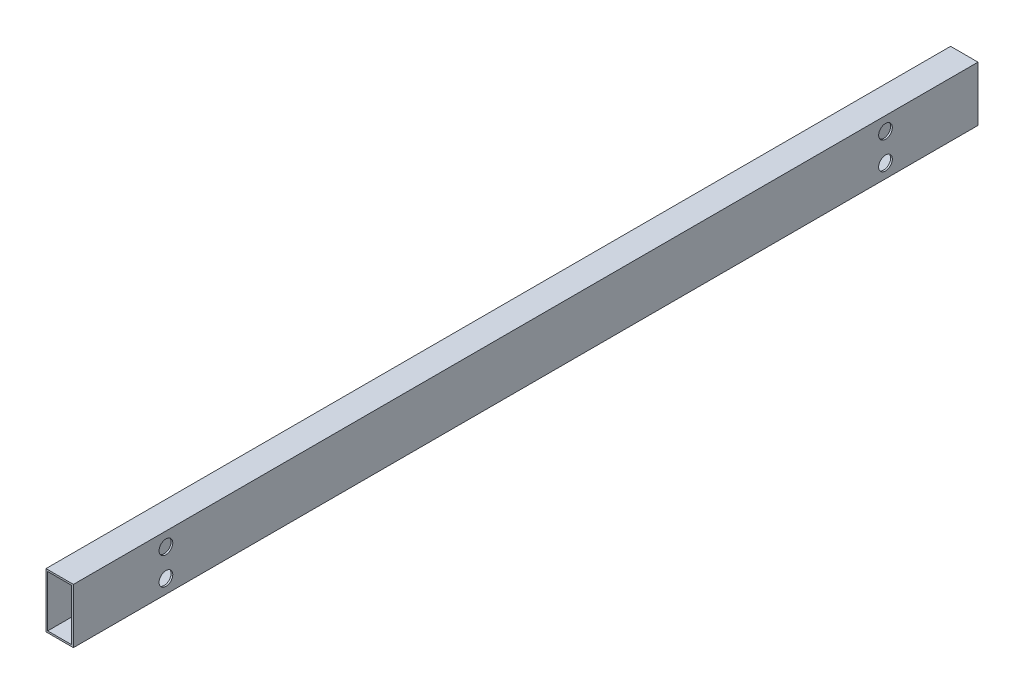
ISO-10303-21;
HEADER;
FILE_DESCRIPTION(('STEP AP214'),'2;1');
FILE_NAME('part.step','',(''),(''),'','','');
FILE_SCHEMA(('AUTOMOTIVE_DESIGN { 1 0 10303 214 1 1 1 1 }'));
ENDSEC;
DATA;
#1=APPLICATION_CONTEXT('core data for automotive mechanical design processes');
#2=APPLICATION_PROTOCOL_DEFINITION('international standard','automotive_design',2000,#1);
#3=PRODUCT_CONTEXT('',#1,'mechanical');
#4=PRODUCT('Part','Part','',(#3));
#5=PRODUCT_RELATED_PRODUCT_CATEGORY('part','',(#4));
#6=PRODUCT_DEFINITION_FORMATION('','',#4);
#7=PRODUCT_DEFINITION_CONTEXT('part definition',#1,'design');
#8=PRODUCT_DEFINITION('design','',#6,#7);
#9=PRODUCT_DEFINITION_SHAPE('','',#8);
#10=(LENGTH_UNIT() NAMED_UNIT(*) SI_UNIT(.MILLI.,.METRE.));
#11=(NAMED_UNIT(*) PLANE_ANGLE_UNIT() SI_UNIT($,.RADIAN.));
#12=(NAMED_UNIT(*) SI_UNIT($,.STERADIAN.) SOLID_ANGLE_UNIT());
#13=UNCERTAINTY_MEASURE_WITH_UNIT(LENGTH_MEASURE(1.E-05),#10,'distance_accuracy_value','');
#14=(GEOMETRIC_REPRESENTATION_CONTEXT(3) GLOBAL_UNCERTAINTY_ASSIGNED_CONTEXT((#13)) GLOBAL_UNIT_ASSIGNED_CONTEXT((#10,
#11,#12)) REPRESENTATION_CONTEXT('',''));
#15=CARTESIAN_POINT('',(0.,0.,0.));
#16=DIRECTION('',(0.,0.,1.));
#17=DIRECTION('',(1.,0.,0.));
#18=AXIS2_PLACEMENT_3D('',#15,#16,#17);
#19=CARTESIAN_POINT('',(0.,0.,838.2));
#20=DIRECTION('',(0.,0.,-1.));
#21=DIRECTION('',(-1.,0.,0.));
#22=AXIS2_PLACEMENT_3D('',#19,#20,#21);
#23=PLANE('',#22);
#24=DIRECTION('',(0.,1.,0.));
#25=VECTOR('',#24,1.);
#26=CARTESIAN_POINT('',(12.7,-25.4,838.2));
#27=LINE('',#26,#25);
#28=CARTESIAN_POINT('',(12.7,-25.4,838.2));
#29=VERTEX_POINT('',#28);
#30=CARTESIAN_POINT('',(12.7,25.4,838.2));
#31=VERTEX_POINT('',#30);
#32=EDGE_CURVE('E139',#29,#31,#27,.T.);
#33=ORIENTED_EDGE('',*,*,#32,.T.);
#34=DIRECTION('',(-1.,0.,0.));
#35=VECTOR('',#34,1.);
#36=CARTESIAN_POINT('',(-12.7,25.4,838.2));
#37=LINE('',#36,#35);
#38=CARTESIAN_POINT('',(-12.7,25.4,838.2));
#39=VERTEX_POINT('',#38);
#40=EDGE_CURVE('E142',#31,#39,#37,.T.);
#41=ORIENTED_EDGE('',*,*,#40,.T.);
#42=DIRECTION('',(0.,-1.,0.));
#43=VECTOR('',#42,1.);
#44=CARTESIAN_POINT('',(-12.7,-25.4,838.2));
#45=LINE('',#44,#43);
#46=CARTESIAN_POINT('',(-12.7,-25.4,838.2));
#47=VERTEX_POINT('',#46);
#48=EDGE_CURVE('E145',#39,#47,#45,.T.);
#49=ORIENTED_EDGE('',*,*,#48,.T.);
#50=DIRECTION('',(1.,0.,0.));
#51=VECTOR('',#50,1.);
#52=CARTESIAN_POINT('',(-12.7,-25.4,838.2));
#53=LINE('',#52,#51);
#54=EDGE_CURVE('E147',#47,#29,#53,.T.);
#55=ORIENTED_EDGE('',*,*,#54,.T.);
#56=EDGE_LOOP('',(#33,#41,#49,#55));
#57=FACE_BOUND('',#56,.T.);
#58=DIRECTION('',(0.,1.,0.));
#59=VECTOR('',#58,1.);
#60=CARTESIAN_POINT('',(11.1125,-23.8125,838.2));
#61=LINE('',#60,#59);
#62=CARTESIAN_POINT('',(11.1125,-23.8125,838.2));
#63=VERTEX_POINT('',#62);
#64=CARTESIAN_POINT('',(11.1125,23.8125,838.2));
#65=VERTEX_POINT('',#64);
#66=EDGE_CURVE('E102',#63,#65,#61,.T.);
#67=ORIENTED_EDGE('',*,*,#66,.F.);
#68=DIRECTION('',(1.,0.,0.));
#69=VECTOR('',#68,1.);
#70=CARTESIAN_POINT('',(-11.1125,-23.8125,838.2));
#71=LINE('',#70,#69);
#72=CARTESIAN_POINT('',(-11.1125,-23.8125,838.2));
#73=VERTEX_POINT('',#72);
#74=EDGE_CURVE('E124',#73,#63,#71,.T.);
#75=ORIENTED_EDGE('',*,*,#74,.F.);
#76=DIRECTION('',(0.,-1.,0.));
#77=VECTOR('',#76,1.);
#78=CARTESIAN_POINT('',(-11.1125,-23.8125,838.2));
#79=LINE('',#78,#77);
#80=CARTESIAN_POINT('',(-11.1125,23.8125,838.2));
#81=VERTEX_POINT('',#80);
#82=EDGE_CURVE('E122',#81,#73,#79,.T.);
#83=ORIENTED_EDGE('',*,*,#82,.F.);
#84=DIRECTION('',(-1.,0.,0.));
#85=VECTOR('',#84,1.);
#86=CARTESIAN_POINT('',(-11.1125,23.8125,838.2));
#87=LINE('',#86,#85);
#88=EDGE_CURVE('E110',#65,#81,#87,.T.);
#89=ORIENTED_EDGE('',*,*,#88,.F.);
#90=EDGE_LOOP('',(#67,#75,#83,#89));
#91=FACE_BOUND('',#90,.T.);
#92=ADVANCED_FACE('F35',(#57,#91),#23,.F.);
#93=CARTESIAN_POINT('',(0.,0.,0.));
#94=DIRECTION('',(0.,0.,-1.));
#95=DIRECTION('',(-1.,0.,0.));
#96=AXIS2_PLACEMENT_3D('',#93,#94,#95);
#97=PLANE('',#96);
#98=DIRECTION('',(0.,1.,0.));
#99=VECTOR('',#98,1.);
#100=CARTESIAN_POINT('',(12.7,-25.4,0.));
#101=LINE('',#100,#99);
#102=CARTESIAN_POINT('',(12.7,-25.4,0.));
#103=VERTEX_POINT('',#102);
#104=CARTESIAN_POINT('',(12.7,25.4,0.));
#105=VERTEX_POINT('',#104);
#106=EDGE_CURVE('E118',#103,#105,#101,.T.);
#107=ORIENTED_EDGE('',*,*,#106,.F.);
#108=DIRECTION('',(1.,0.,0.));
#109=VECTOR('',#108,1.);
#110=CARTESIAN_POINT('',(-12.7,-25.4,0.));
#111=LINE('',#110,#109);
#112=CARTESIAN_POINT('',(-12.7,-25.4,0.));
#113=VERTEX_POINT('',#112);
#114=EDGE_CURVE('E143',#113,#103,#111,.T.);
#115=ORIENTED_EDGE('',*,*,#114,.F.);
#116=DIRECTION('',(0.,-1.,0.));
#117=VECTOR('',#116,1.);
#118=CARTESIAN_POINT('',(-12.7,-25.4,0.));
#119=LINE('',#118,#117);
#120=CARTESIAN_POINT('',(-12.7,25.4,0.));
#121=VERTEX_POINT('',#120);
#122=EDGE_CURVE('E154',#121,#113,#119,.T.);
#123=ORIENTED_EDGE('',*,*,#122,.F.);
#124=DIRECTION('',(-1.,0.,0.));
#125=VECTOR('',#124,1.);
#126=CARTESIAN_POINT('',(-12.7,25.4,0.));
#127=LINE('',#126,#125);
#128=EDGE_CURVE('E152',#105,#121,#127,.T.);
#129=ORIENTED_EDGE('',*,*,#128,.F.);
#130=EDGE_LOOP('',(#107,#115,#123,#129));
#131=FACE_BOUND('',#130,.T.);
#132=DIRECTION('',(1.,0.,0.));
#133=VECTOR('',#132,1.);
#134=CARTESIAN_POINT('',(-11.1125,-23.8125,0.));
#135=LINE('',#134,#133);
#136=CARTESIAN_POINT('',(-11.1125,-23.8125,0.));
#137=VERTEX_POINT('',#136);
#138=CARTESIAN_POINT('',(11.1125,-23.8125,0.));
#139=VERTEX_POINT('',#138);
#140=EDGE_CURVE('E111',#137,#139,#135,.T.);
#141=ORIENTED_EDGE('',*,*,#140,.T.);
#142=DIRECTION('',(0.,1.,0.));
#143=VECTOR('',#142,1.);
#144=CARTESIAN_POINT('',(11.1125,-23.8125,0.));
#145=LINE('',#144,#143);
#146=CARTESIAN_POINT('',(11.1125,23.8125,0.));
#147=VERTEX_POINT('',#146);
#148=EDGE_CURVE('E60',#139,#147,#145,.T.);
#149=ORIENTED_EDGE('',*,*,#148,.T.);
#150=DIRECTION('',(-1.,0.,0.));
#151=VECTOR('',#150,1.);
#152=CARTESIAN_POINT('',(-11.1125,23.8125,0.));
#153=LINE('',#152,#151);
#154=CARTESIAN_POINT('',(-11.1125,23.8125,0.));
#155=VERTEX_POINT('',#154);
#156=EDGE_CURVE('E117',#147,#155,#153,.T.);
#157=ORIENTED_EDGE('',*,*,#156,.T.);
#158=DIRECTION('',(0.,-1.,0.));
#159=VECTOR('',#158,1.);
#160=CARTESIAN_POINT('',(-11.1125,-23.8125,0.));
#161=LINE('',#160,#159);
#162=EDGE_CURVE('E131',#155,#137,#161,.T.);
#163=ORIENTED_EDGE('',*,*,#162,.T.);
#164=EDGE_LOOP('',(#141,#149,#157,#163));
#165=FACE_BOUND('',#164,.T.);
#166=ADVANCED_FACE('F192',(#131,#165),#97,.T.);
#167=CARTESIAN_POINT('',(12.7,-25.4,838.2));
#168=DIRECTION('',(-1.,0.,0.));
#169=DIRECTION('',(0.,0.,1.));
#170=AXIS2_PLACEMENT_3D('',#167,#168,#169);
#171=PLANE('',#170);
#172=CARTESIAN_POINT('',(12.7,-12.7,752.475));
#173=DIRECTION('',(1.,0.,0.));
#174=DIRECTION('',(0.,0.,-1.));
#175=AXIS2_PLACEMENT_3D('',#172,#173,#174);
#176=CIRCLE('',#175,6.34999999999994);
#177=CARTESIAN_POINT('',(12.7,-12.7,746.125));
#178=VERTEX_POINT('',#177);
#179=EDGE_CURVE('E244',#178,#178,#176,.T.);
#180=ORIENTED_EDGE('',*,*,#179,.F.);
#181=EDGE_LOOP('',(#180));
#182=FACE_BOUND('',#181,.T.);
#183=CARTESIAN_POINT('',(12.7,12.7,85.7249999999999));
#184=DIRECTION('',(1.,0.,0.));
#185=DIRECTION('',(0.,0.,-1.));
#186=AXIS2_PLACEMENT_3D('',#183,#184,#185);
#187=CIRCLE('',#186,6.35);
#188=CARTESIAN_POINT('',(12.7,12.7,79.3749999999999));
#189=VERTEX_POINT('',#188);
#190=EDGE_CURVE('E248',#189,#189,#187,.T.);
#191=ORIENTED_EDGE('',*,*,#190,.F.);
#192=EDGE_LOOP('',(#191));
#193=FACE_BOUND('',#192,.T.);
#194=CARTESIAN_POINT('',(12.7,-12.7,85.725));
#195=DIRECTION('',(1.,0.,0.));
#196=DIRECTION('',(0.,0.,-1.));
#197=AXIS2_PLACEMENT_3D('',#194,#195,#196);
#198=CIRCLE('',#197,6.35);
#199=CARTESIAN_POINT('',(12.7,-12.7,79.375));
#200=VERTEX_POINT('',#199);
#201=EDGE_CURVE('E252',#200,#200,#198,.T.);
#202=ORIENTED_EDGE('',*,*,#201,.F.);
#203=EDGE_LOOP('',(#202));
#204=FACE_BOUND('',#203,.T.);
#205=CARTESIAN_POINT('',(12.7,12.7,752.475));
#206=DIRECTION('',(1.,0.,0.));
#207=DIRECTION('',(0.,0.,-1.));
#208=AXIS2_PLACEMENT_3D('',#205,#206,#207);
#209=CIRCLE('',#208,6.34999999999994);
#210=CARTESIAN_POINT('',(12.7,12.7,746.125));
#211=VERTEX_POINT('',#210);
#212=EDGE_CURVE('E255',#211,#211,#209,.T.);
#213=ORIENTED_EDGE('',*,*,#212,.F.);
#214=EDGE_LOOP('',(#213));
#215=FACE_BOUND('',#214,.T.);
#216=ORIENTED_EDGE('',*,*,#106,.T.);
#217=DIRECTION('',(0.,0.,-1.));
#218=VECTOR('',#217,1.);
#219=CARTESIAN_POINT('',(12.7,25.4,838.2));
#220=LINE('',#219,#218);
#221=EDGE_CURVE('E11',#31,#105,#220,.T.);
#222=ORIENTED_EDGE('',*,*,#221,.F.);
#223=ORIENTED_EDGE('',*,*,#32,.F.);
#224=DIRECTION('',(0.,0.,-1.));
#225=VECTOR('',#224,1.);
#226=CARTESIAN_POINT('',(12.7,-25.4,838.2));
#227=LINE('',#226,#225);
#228=EDGE_CURVE('E149',#29,#103,#227,.T.);
#229=ORIENTED_EDGE('',*,*,#228,.T.);
#230=EDGE_LOOP('',(#216,#222,#223,#229));
#231=FACE_BOUND('',#230,.T.);
#232=ADVANCED_FACE('F37',(#182,#193,#204,#215,#231),#171,.F.);
#233=CARTESIAN_POINT('',(-12.7,25.4,838.2));
#234=DIRECTION('',(0.,-1.,0.));
#235=DIRECTION('',(0.,0.,-1.));
#236=AXIS2_PLACEMENT_3D('',#233,#234,#235);
#237=PLANE('',#236);
#238=ORIENTED_EDGE('',*,*,#128,.T.);
#239=DIRECTION('',(0.,0.,-1.));
#240=VECTOR('',#239,1.);
#241=CARTESIAN_POINT('',(-12.7,25.4,838.2));
#242=LINE('',#241,#240);
#243=EDGE_CURVE('E44',#39,#121,#242,.T.);
#244=ORIENTED_EDGE('',*,*,#243,.F.);
#245=ORIENTED_EDGE('',*,*,#40,.F.);
#246=ORIENTED_EDGE('',*,*,#221,.T.);
#247=EDGE_LOOP('',(#238,#244,#245,#246));
#248=FACE_BOUND('',#247,.T.);
#249=ADVANCED_FACE('F219',(#248),#237,.F.);
#250=CARTESIAN_POINT('',(-12.7,-25.4,838.2));
#251=DIRECTION('',(1.,0.,0.));
#252=DIRECTION('',(0.,0.,-1.));
#253=AXIS2_PLACEMENT_3D('',#250,#251,#252);
#254=PLANE('',#253);
#255=CARTESIAN_POINT('',(-12.7,-12.7,85.725));
#256=DIRECTION('',(1.,0.,0.));
#257=DIRECTION('',(0.,0.,-1.));
#258=AXIS2_PLACEMENT_3D('',#255,#256,#257);
#259=CIRCLE('',#258,3.175);
#260=CARTESIAN_POINT('',(-12.7,-12.7,82.55));
#261=VERTEX_POINT('',#260);
#262=EDGE_CURVE('E269',#261,#261,#259,.T.);
#263=ORIENTED_EDGE('',*,*,#262,.T.);
#264=EDGE_LOOP('',(#263));
#265=FACE_BOUND('',#264,.T.);
#266=CARTESIAN_POINT('',(-12.7,12.7,752.475));
#267=DIRECTION('',(1.,0.,0.));
#268=DIRECTION('',(0.,0.,-1.));
#269=AXIS2_PLACEMENT_3D('',#266,#267,#268);
#270=CIRCLE('',#269,3.17500000000008);
#271=CARTESIAN_POINT('',(-12.7,12.7,749.3));
#272=VERTEX_POINT('',#271);
#273=EDGE_CURVE('E261',#272,#272,#270,.T.);
#274=ORIENTED_EDGE('',*,*,#273,.T.);
#275=EDGE_LOOP('',(#274));
#276=FACE_BOUND('',#275,.T.);
#277=CARTESIAN_POINT('',(-12.7,-12.7,752.475));
#278=DIRECTION('',(1.,0.,0.));
#279=DIRECTION('',(0.,0.,-1.));
#280=AXIS2_PLACEMENT_3D('',#277,#278,#279);
#281=CIRCLE('',#280,3.17500000000008);
#282=CARTESIAN_POINT('',(-12.7,-12.7,749.3));
#283=VERTEX_POINT('',#282);
#284=EDGE_CURVE('E257',#283,#283,#281,.T.);
#285=ORIENTED_EDGE('',*,*,#284,.T.);
#286=EDGE_LOOP('',(#285));
#287=FACE_BOUND('',#286,.T.);
#288=CARTESIAN_POINT('',(-12.7,12.7,85.7249999999999));
#289=DIRECTION('',(1.,0.,0.));
#290=DIRECTION('',(0.,0.,-1.));
#291=AXIS2_PLACEMENT_3D('',#288,#289,#290);
#292=CIRCLE('',#291,3.175);
#293=CARTESIAN_POINT('',(-12.7,12.7,82.5499999999999));
#294=VERTEX_POINT('',#293);
#295=EDGE_CURVE('E168',#294,#294,#292,.T.);
#296=ORIENTED_EDGE('',*,*,#295,.T.);
#297=EDGE_LOOP('',(#296));
#298=FACE_BOUND('',#297,.T.);
#299=ORIENTED_EDGE('',*,*,#122,.T.);
#300=DIRECTION('',(0.,0.,-1.));
#301=VECTOR('',#300,1.);
#302=CARTESIAN_POINT('',(-12.7,-25.4,838.2));
#303=LINE('',#302,#301);
#304=EDGE_CURVE('E159',#47,#113,#303,.T.);
#305=ORIENTED_EDGE('',*,*,#304,.F.);
#306=ORIENTED_EDGE('',*,*,#48,.F.);
#307=ORIENTED_EDGE('',*,*,#243,.T.);
#308=EDGE_LOOP('',(#299,#305,#306,#307));
#309=FACE_BOUND('',#308,.T.);
#310=ADVANCED_FACE('F216',(#265,#276,#287,#298,#309),#254,.F.);
#311=CARTESIAN_POINT('',(-12.7,-25.4,838.2));
#312=DIRECTION('',(0.,1.,0.));
#313=DIRECTION('',(0.,0.,1.));
#314=AXIS2_PLACEMENT_3D('',#311,#312,#313);
#315=PLANE('',#314);
#316=ORIENTED_EDGE('',*,*,#114,.T.);
#317=ORIENTED_EDGE('',*,*,#228,.F.);
#318=ORIENTED_EDGE('',*,*,#54,.F.);
#319=ORIENTED_EDGE('',*,*,#304,.T.);
#320=EDGE_LOOP('',(#316,#317,#318,#319));
#321=FACE_BOUND('',#320,.T.);
#322=ADVANCED_FACE('F213',(#321),#315,.F.);
#323=CARTESIAN_POINT('',(11.1125,-23.8125,838.2));
#324=DIRECTION('',(-1.,0.,0.));
#325=DIRECTION('',(0.,0.,1.));
#326=AXIS2_PLACEMENT_3D('',#323,#324,#325);
#327=PLANE('',#326);
#328=CARTESIAN_POINT('',(11.1125,-12.7,752.475));
#329=DIRECTION('',(-1.,0.,0.));
#330=DIRECTION('',(0.,0.,1.));
#331=AXIS2_PLACEMENT_3D('',#328,#329,#330);
#332=CIRCLE('',#331,6.34999999999994);
#333=CARTESIAN_POINT('',(11.1125,-12.7,746.125));
#334=VERTEX_POINT('',#333);
#335=EDGE_CURVE('E318',#334,#334,#332,.F.);
#336=ORIENTED_EDGE('',*,*,#335,.T.);
#337=EDGE_LOOP('',(#336));
#338=FACE_BOUND('',#337,.T.);
#339=CARTESIAN_POINT('',(11.1125,12.7,85.7249999999999));
#340=DIRECTION('',(-1.,0.,0.));
#341=DIRECTION('',(0.,0.,1.));
#342=AXIS2_PLACEMENT_3D('',#339,#340,#341);
#343=CIRCLE('',#342,6.35);
#344=CARTESIAN_POINT('',(11.1125,12.7,79.3749999999999));
#345=VERTEX_POINT('',#344);
#346=EDGE_CURVE('E266',#345,#345,#343,.F.);
#347=ORIENTED_EDGE('',*,*,#346,.T.);
#348=EDGE_LOOP('',(#347));
#349=FACE_BOUND('',#348,.T.);
#350=CARTESIAN_POINT('',(11.1125,-12.7,85.725));
#351=DIRECTION('',(-1.,0.,0.));
#352=DIRECTION('',(0.,0.,1.));
#353=AXIS2_PLACEMENT_3D('',#350,#351,#352);
#354=CIRCLE('',#353,6.35);
#355=CARTESIAN_POINT('',(11.1125,-12.7,79.375));
#356=VERTEX_POINT('',#355);
#357=EDGE_CURVE('E312',#356,#356,#354,.F.);
#358=ORIENTED_EDGE('',*,*,#357,.T.);
#359=EDGE_LOOP('',(#358));
#360=FACE_BOUND('',#359,.T.);
#361=CARTESIAN_POINT('',(11.1125,12.7,752.475));
#362=DIRECTION('',(-1.,0.,0.));
#363=DIRECTION('',(0.,0.,1.));
#364=AXIS2_PLACEMENT_3D('',#361,#362,#363);
#365=CIRCLE('',#364,6.34999999999994);
#366=CARTESIAN_POINT('',(11.1125,12.7,746.125));
#367=VERTEX_POINT('',#366);
#368=EDGE_CURVE('E258',#367,#367,#365,.F.);
#369=ORIENTED_EDGE('',*,*,#368,.T.);
#370=EDGE_LOOP('',(#369));
#371=FACE_BOUND('',#370,.T.);
#372=ORIENTED_EDGE('',*,*,#148,.F.);
#373=DIRECTION('',(0.,0.,-1.));
#374=VECTOR('',#373,1.);
#375=CARTESIAN_POINT('',(11.1125,-23.8125,838.2));
#376=LINE('',#375,#374);
#377=EDGE_CURVE('E106',#63,#139,#376,.T.);
#378=ORIENTED_EDGE('',*,*,#377,.F.);
#379=ORIENTED_EDGE('',*,*,#66,.T.);
#380=DIRECTION('',(0.,0.,-1.));
#381=VECTOR('',#380,1.);
#382=CARTESIAN_POINT('',(11.1125,23.8125,838.2));
#383=LINE('',#382,#381);
#384=EDGE_CURVE('E105',#65,#147,#383,.T.);
#385=ORIENTED_EDGE('',*,*,#384,.T.);
#386=EDGE_LOOP('',(#372,#378,#379,#385));
#387=FACE_BOUND('',#386,.T.);
#388=ADVANCED_FACE('F104',(#338,#349,#360,#371,#387),#327,.T.);
#389=CARTESIAN_POINT('',(-11.1125,23.8125,838.2));
#390=DIRECTION('',(0.,-1.,0.));
#391=DIRECTION('',(0.,0.,-1.));
#392=AXIS2_PLACEMENT_3D('',#389,#390,#391);
#393=PLANE('',#392);
#394=ORIENTED_EDGE('',*,*,#156,.F.);
#395=ORIENTED_EDGE('',*,*,#384,.F.);
#396=ORIENTED_EDGE('',*,*,#88,.T.);
#397=DIRECTION('',(0.,0.,-1.));
#398=VECTOR('',#397,1.);
#399=CARTESIAN_POINT('',(-11.1125,23.8125,838.2));
#400=LINE('',#399,#398);
#401=EDGE_CURVE('E119',#81,#155,#400,.T.);
#402=ORIENTED_EDGE('',*,*,#401,.T.);
#403=EDGE_LOOP('',(#394,#395,#396,#402));
#404=FACE_BOUND('',#403,.T.);
#405=ADVANCED_FACE('F114',(#404),#393,.T.);
#406=CARTESIAN_POINT('',(-11.1125,-23.8125,838.2));
#407=DIRECTION('',(1.,0.,0.));
#408=DIRECTION('',(0.,0.,-1.));
#409=AXIS2_PLACEMENT_3D('',#406,#407,#408);
#410=PLANE('',#409);
#411=CARTESIAN_POINT('',(-11.1125,-12.7,85.725));
#412=DIRECTION('',(1.,0.,0.));
#413=DIRECTION('',(0.,0.,-1.));
#414=AXIS2_PLACEMENT_3D('',#411,#412,#413);
#415=CIRCLE('',#414,3.175);
#416=CARTESIAN_POINT('',(-11.1125,-12.7,82.55));
#417=VERTEX_POINT('',#416);
#418=EDGE_CURVE('E39',#417,#417,#415,.T.);
#419=ORIENTED_EDGE('',*,*,#418,.F.);
#420=EDGE_LOOP('',(#419));
#421=FACE_BOUND('',#420,.T.);
#422=CARTESIAN_POINT('',(-11.1125,12.7,752.475));
#423=DIRECTION('',(1.,0.,0.));
#424=DIRECTION('',(0.,0.,-1.));
#425=AXIS2_PLACEMENT_3D('',#422,#423,#424);
#426=CIRCLE('',#425,3.17500000000008);
#427=CARTESIAN_POINT('',(-11.1125,12.7,749.3));
#428=VERTEX_POINT('',#427);
#429=EDGE_CURVE('E170',#428,#428,#426,.T.);
#430=ORIENTED_EDGE('',*,*,#429,.F.);
#431=EDGE_LOOP('',(#430));
#432=FACE_BOUND('',#431,.T.);
#433=CARTESIAN_POINT('',(-11.1125,-12.7,752.475));
#434=DIRECTION('',(1.,0.,0.));
#435=DIRECTION('',(0.,0.,-1.));
#436=AXIS2_PLACEMENT_3D('',#433,#434,#435);
#437=CIRCLE('',#436,3.17500000000008);
#438=CARTESIAN_POINT('',(-11.1125,-12.7,749.3));
#439=VERTEX_POINT('',#438);
#440=EDGE_CURVE('E167',#439,#439,#437,.T.);
#441=ORIENTED_EDGE('',*,*,#440,.F.);
#442=EDGE_LOOP('',(#441));
#443=FACE_BOUND('',#442,.T.);
#444=CARTESIAN_POINT('',(-11.1125,12.7,85.7249999999999));
#445=DIRECTION('',(1.,0.,0.));
#446=DIRECTION('',(0.,0.,-1.));
#447=AXIS2_PLACEMENT_3D('',#444,#445,#446);
#448=CIRCLE('',#447,3.175);
#449=CARTESIAN_POINT('',(-11.1125,12.7,82.5499999999999));
#450=VERTEX_POINT('',#449);
#451=EDGE_CURVE('E164',#450,#450,#448,.T.);
#452=ORIENTED_EDGE('',*,*,#451,.F.);
#453=EDGE_LOOP('',(#452));
#454=FACE_BOUND('',#453,.T.);
#455=ORIENTED_EDGE('',*,*,#162,.F.);
#456=ORIENTED_EDGE('',*,*,#401,.F.);
#457=ORIENTED_EDGE('',*,*,#82,.T.);
#458=DIRECTION('',(0.,0.,-1.));
#459=VECTOR('',#458,1.);
#460=CARTESIAN_POINT('',(-11.1125,-23.8125,838.2));
#461=LINE('',#460,#459);
#462=EDGE_CURVE('E52',#73,#137,#461,.T.);
#463=ORIENTED_EDGE('',*,*,#462,.T.);
#464=EDGE_LOOP('',(#455,#456,#457,#463));
#465=FACE_BOUND('',#464,.T.);
#466=ADVANCED_FACE('F180',(#421,#432,#443,#454,#465),#410,.T.);
#467=CARTESIAN_POINT('',(-11.1125,-23.8125,838.2));
#468=DIRECTION('',(0.,1.,0.));
#469=DIRECTION('',(0.,0.,1.));
#470=AXIS2_PLACEMENT_3D('',#467,#468,#469);
#471=PLANE('',#470);
#472=ORIENTED_EDGE('',*,*,#140,.F.);
#473=ORIENTED_EDGE('',*,*,#462,.F.);
#474=ORIENTED_EDGE('',*,*,#74,.T.);
#475=ORIENTED_EDGE('',*,*,#377,.T.);
#476=EDGE_LOOP('',(#472,#473,#474,#475));
#477=FACE_BOUND('',#476,.T.);
#478=ADVANCED_FACE('F183',(#477),#471,.T.);
#479=CARTESIAN_POINT('',(-12.7,12.7,85.7249999999999));
#480=DIRECTION('',(1.,0.,0.));
#481=DIRECTION('',(0.,0.,-1.));
#482=AXIS2_PLACEMENT_3D('',#479,#480,#481);
#483=CYLINDRICAL_SURFACE('',#482,3.175);
#484=ORIENTED_EDGE('',*,*,#451,.T.);
#485=EDGE_LOOP('',(#484));
#486=FACE_BOUND('',#485,.T.);
#487=ORIENTED_EDGE('',*,*,#295,.F.);
#488=EDGE_LOOP('',(#487));
#489=FACE_BOUND('',#488,.T.);
#490=ADVANCED_FACE('F194',(#486,#489),#483,.F.);
#491=CARTESIAN_POINT('',(-12.7,-12.7,752.475));
#492=DIRECTION('',(1.,0.,0.));
#493=DIRECTION('',(0.,0.,-1.));
#494=AXIS2_PLACEMENT_3D('',#491,#492,#493);
#495=CYLINDRICAL_SURFACE('',#494,3.17500000000008);
#496=ORIENTED_EDGE('',*,*,#440,.T.);
#497=EDGE_LOOP('',(#496));
#498=FACE_BOUND('',#497,.T.);
#499=ORIENTED_EDGE('',*,*,#284,.F.);
#500=EDGE_LOOP('',(#499));
#501=FACE_BOUND('',#500,.T.);
#502=ADVANCED_FACE('F199',(#498,#501),#495,.F.);
#503=CARTESIAN_POINT('',(-12.7,12.7,752.475));
#504=DIRECTION('',(1.,0.,0.));
#505=DIRECTION('',(0.,0.,-1.));
#506=AXIS2_PLACEMENT_3D('',#503,#504,#505);
#507=CYLINDRICAL_SURFACE('',#506,3.17500000000008);
#508=ORIENTED_EDGE('',*,*,#429,.T.);
#509=EDGE_LOOP('',(#508));
#510=FACE_BOUND('',#509,.T.);
#511=ORIENTED_EDGE('',*,*,#273,.F.);
#512=EDGE_LOOP('',(#511));
#513=FACE_BOUND('',#512,.T.);
#514=ADVANCED_FACE('F281',(#510,#513),#507,.F.);
#515=CARTESIAN_POINT('',(-12.7,-12.7,85.725));
#516=DIRECTION('',(1.,0.,0.));
#517=DIRECTION('',(0.,0.,-1.));
#518=AXIS2_PLACEMENT_3D('',#515,#516,#517);
#519=CYLINDRICAL_SURFACE('',#518,3.175);
#520=ORIENTED_EDGE('',*,*,#418,.T.);
#521=EDGE_LOOP('',(#520));
#522=FACE_BOUND('',#521,.T.);
#523=ORIENTED_EDGE('',*,*,#262,.F.);
#524=EDGE_LOOP('',(#523));
#525=FACE_BOUND('',#524,.T.);
#526=ADVANCED_FACE('F177',(#522,#525),#519,.F.);
#527=CARTESIAN_POINT('',(-12.701,12.7,752.475));
#528=DIRECTION('',(1.,0.,0.));
#529=DIRECTION('',(0.,0.,-1.));
#530=AXIS2_PLACEMENT_3D('',#527,#528,#529);
#531=CYLINDRICAL_SURFACE('',#530,6.34999999999994);
#532=CARTESIAN_POINT('',(11.1125,12.7,746.125));
#533=CARTESIAN_POINT('',(11.1290364583333,12.7,746.125));
#534=CARTESIAN_POINT('',(11.1455729166667,12.7,746.125));
#535=CARTESIAN_POINT('',(11.1786458333333,12.7,746.125));
#536=CARTESIAN_POINT('',(11.1951822916667,12.7,746.125));
#537=CARTESIAN_POINT('',(11.2282552083333,12.7,746.125));
#538=CARTESIAN_POINT('',(11.2447916666667,12.7,746.125));
#539=CARTESIAN_POINT('',(11.2778645833333,12.7,746.125));
#540=CARTESIAN_POINT('',(11.2944010416667,12.7,746.125));
#541=CARTESIAN_POINT('',(11.3274739583333,12.7,746.125));
#542=CARTESIAN_POINT('',(11.3440104166667,12.7,746.125));
#543=CARTESIAN_POINT('',(11.3770833333333,12.7,746.125));
#544=CARTESIAN_POINT('',(11.3936197916667,12.7,746.125));
#545=CARTESIAN_POINT('',(11.4266927083333,12.7,746.125));
#546=CARTESIAN_POINT('',(11.4432291666667,12.7,746.125));
#547=CARTESIAN_POINT('',(11.4763020833333,12.7,746.125));
#548=CARTESIAN_POINT('',(11.4928385416667,12.7,746.125));
#549=CARTESIAN_POINT('',(11.5259114583333,12.7,746.125));
#550=CARTESIAN_POINT('',(11.5424479166667,12.7,746.125));
#551=CARTESIAN_POINT('',(11.5755208333333,12.7,746.125));
#552=CARTESIAN_POINT('',(11.5920572916667,12.7,746.125));
#553=CARTESIAN_POINT('',(11.6251302083333,12.7,746.125));
#554=CARTESIAN_POINT('',(11.6416666666667,12.7,746.125));
#555=CARTESIAN_POINT('',(11.6747395833333,12.7,746.125));
#556=CARTESIAN_POINT('',(11.6912760416667,12.7,746.125));
#557=CARTESIAN_POINT('',(11.7243489583333,12.7,746.125));
#558=CARTESIAN_POINT('',(11.7408854166667,12.7,746.125));
#559=CARTESIAN_POINT('',(11.7739583333333,12.7,746.125));
#560=CARTESIAN_POINT('',(11.7904947916667,12.7,746.125));
#561=CARTESIAN_POINT('',(11.8235677083333,12.7,746.125));
#562=CARTESIAN_POINT('',(11.8401041666667,12.7,746.125));
#563=CARTESIAN_POINT('',(11.8731770833333,12.7,746.125));
#564=CARTESIAN_POINT('',(11.8897135416667,12.7,746.125));
#565=CARTESIAN_POINT('',(11.9227864583333,12.7,746.125));
#566=CARTESIAN_POINT('',(11.9393229166667,12.7,746.125));
#567=CARTESIAN_POINT('',(11.9723958333333,12.7,746.125));
#568=CARTESIAN_POINT('',(11.9889322916667,12.7,746.125));
#569=CARTESIAN_POINT('',(12.0220052083333,12.7,746.125));
#570=CARTESIAN_POINT('',(12.0385416666667,12.7,746.125));
#571=CARTESIAN_POINT('',(12.0716145833333,12.7,746.125));
#572=CARTESIAN_POINT('',(12.0881510416667,12.7,746.125));
#573=CARTESIAN_POINT('',(12.1212239583333,12.7,746.125));
#574=CARTESIAN_POINT('',(12.1377604166667,12.7,746.125));
#575=CARTESIAN_POINT('',(12.1708333333333,12.7,746.125));
#576=CARTESIAN_POINT('',(12.1873697916667,12.7,746.125));
#577=CARTESIAN_POINT('',(12.2204427083333,12.7,746.125));
#578=CARTESIAN_POINT('',(12.2369791666667,12.7,746.125));
#579=CARTESIAN_POINT('',(12.2700520833333,12.7,746.125));
#580=CARTESIAN_POINT('',(12.2865885416667,12.7,746.125));
#581=CARTESIAN_POINT('',(12.3196614583333,12.7,746.125));
#582=CARTESIAN_POINT('',(12.3361979166667,12.7,746.125));
#583=CARTESIAN_POINT('',(12.3692708333333,12.7,746.125));
#584=CARTESIAN_POINT('',(12.3858072916667,12.7,746.125));
#585=CARTESIAN_POINT('',(12.4188802083333,12.7,746.125));
#586=CARTESIAN_POINT('',(12.4354166666667,12.7,746.125));
#587=CARTESIAN_POINT('',(12.4684895833333,12.7,746.125));
#588=CARTESIAN_POINT('',(12.4850260416667,12.7,746.125));
#589=CARTESIAN_POINT('',(12.5180989583333,12.7,746.125));
#590=CARTESIAN_POINT('',(12.5346354166667,12.7,746.125));
#591=CARTESIAN_POINT('',(12.5677083333333,12.7,746.125));
#592=CARTESIAN_POINT('',(12.5842447916667,12.7,746.125));
#593=CARTESIAN_POINT('',(12.6173177083333,12.7,746.125));
#594=CARTESIAN_POINT('',(12.6338541666667,12.7,746.125));
#595=CARTESIAN_POINT('',(12.6669270833333,12.7,746.125));
#596=CARTESIAN_POINT('',(12.6834635416667,12.7,746.125));
#597=CARTESIAN_POINT('',(12.7,12.7,746.125));
#598=B_SPLINE_CURVE_WITH_KNOTS('',3,(#532,#533,#534,#535,#536,#537,#538,#539,#540,#541,#542,
#543,#544,#545,#546,#547,#548,#549,#550,#551,#552,#553,#554,#555,#556,#557,#558,#559,#560,#561,
#562,#563,#564,#565,#566,#567,#568,#569,#570,#571,#572,#573,#574,#575,#576,#577,#578,#579,#580,
#581,#582,#583,#584,#585,#586,#587,#588,#589,#590,#591,#592,#593,#594,#595,#596,#597),
.UNSPECIFIED.,.F.,.F.,(4,2,2,2,2,2,2,2,2,2,2,2,2,2,2,2,2,2,2,2,2,2,2,2,2,2,2,2,2,2,2,2,4),(0.,
0.0496093749999989,0.0992187499999977,0.148828125,0.198437499999999,0.248046874999998,
0.29765625,0.347265624999999,0.396874999999998,0.446484374999997,0.496093749999996,
0.545703124999998,0.595312499999997,0.644921874999996,0.694531249999998,0.744140624999997,
0.793749999999996,0.843359374999995,0.892968749999994,0.942578124999996,0.992187499999995,
1.04179687499999,1.09140625,1.14101562499999,1.19062499999999,1.24023437499999,1.28984374999999,
1.33945312499999,1.38906249999999,1.43867187499999,1.48828124999999,1.53789062499999,
1.58749999999999),.UNSPECIFIED.);
#599=EDGE_CURVE('BSEAM288',#367,#211,#598,.T.);
#600=ORIENTED_EDGE('',*,*,#368,.F.);
#601=ORIENTED_EDGE('',*,*,#212,.T.);
#602=ORIENTED_EDGE('',*,*,#599,.T.);
#603=ORIENTED_EDGE('',*,*,#599,.F.);
#604=EDGE_LOOP('',(#600,#602,#601,#603));
#605=FACE_BOUND('',#604,.T.);
#606=ADVANCED_FACE('F288',(#605),#531,.F.);
#607=CARTESIAN_POINT('',(-12.701,-12.7,85.725));
#608=DIRECTION('',(1.,0.,0.));
#609=DIRECTION('',(0.,0.,-1.));
#610=AXIS2_PLACEMENT_3D('',#607,#608,#609);
#611=CYLINDRICAL_SURFACE('',#610,6.35);
#612=CARTESIAN_POINT('',(11.1125,-12.7,79.375));
#613=CARTESIAN_POINT('',(11.1290364583333,-12.7,79.375));
#614=CARTESIAN_POINT('',(11.1455729166667,-12.7,79.375));
#615=CARTESIAN_POINT('',(11.1786458333333,-12.7,79.375));
#616=CARTESIAN_POINT('',(11.1951822916667,-12.7,79.375));
#617=CARTESIAN_POINT('',(11.2282552083333,-12.7,79.375));
#618=CARTESIAN_POINT('',(11.2447916666667,-12.7,79.375));
#619=CARTESIAN_POINT('',(11.2778645833333,-12.7,79.375));
#620=CARTESIAN_POINT('',(11.2944010416667,-12.7,79.375));
#621=CARTESIAN_POINT('',(11.3274739583333,-12.7,79.375));
#622=CARTESIAN_POINT('',(11.3440104166667,-12.7,79.375));
#623=CARTESIAN_POINT('',(11.3770833333333,-12.7,79.375));
#624=CARTESIAN_POINT('',(11.3936197916667,-12.7,79.375));
#625=CARTESIAN_POINT('',(11.4266927083333,-12.7,79.375));
#626=CARTESIAN_POINT('',(11.4432291666667,-12.7,79.375));
#627=CARTESIAN_POINT('',(11.4763020833333,-12.7,79.375));
#628=CARTESIAN_POINT('',(11.4928385416667,-12.7,79.375));
#629=CARTESIAN_POINT('',(11.5259114583333,-12.7,79.375));
#630=CARTESIAN_POINT('',(11.5424479166667,-12.7,79.375));
#631=CARTESIAN_POINT('',(11.5755208333333,-12.7,79.375));
#632=CARTESIAN_POINT('',(11.5920572916667,-12.7,79.375));
#633=CARTESIAN_POINT('',(11.6251302083333,-12.7,79.375));
#634=CARTESIAN_POINT('',(11.6416666666667,-12.7,79.375));
#635=CARTESIAN_POINT('',(11.6747395833333,-12.7,79.375));
#636=CARTESIAN_POINT('',(11.6912760416667,-12.7,79.375));
#637=CARTESIAN_POINT('',(11.7243489583333,-12.7,79.375));
#638=CARTESIAN_POINT('',(11.7408854166667,-12.7,79.375));
#639=CARTESIAN_POINT('',(11.7739583333333,-12.7,79.375));
#640=CARTESIAN_POINT('',(11.7904947916667,-12.7,79.375));
#641=CARTESIAN_POINT('',(11.8235677083333,-12.7,79.375));
#642=CARTESIAN_POINT('',(11.8401041666667,-12.7,79.375));
#643=CARTESIAN_POINT('',(11.8731770833333,-12.7,79.375));
#644=CARTESIAN_POINT('',(11.8897135416667,-12.7,79.375));
#645=CARTESIAN_POINT('',(11.9227864583333,-12.7,79.375));
#646=CARTESIAN_POINT('',(11.9393229166667,-12.7,79.375));
#647=CARTESIAN_POINT('',(11.9723958333333,-12.7,79.375));
#648=CARTESIAN_POINT('',(11.9889322916667,-12.7,79.375));
#649=CARTESIAN_POINT('',(12.0220052083333,-12.7,79.375));
#650=CARTESIAN_POINT('',(12.0385416666667,-12.7,79.375));
#651=CARTESIAN_POINT('',(12.0716145833333,-12.7,79.375));
#652=CARTESIAN_POINT('',(12.0881510416667,-12.7,79.375));
#653=CARTESIAN_POINT('',(12.1212239583333,-12.7,79.375));
#654=CARTESIAN_POINT('',(12.1377604166667,-12.7,79.375));
#655=CARTESIAN_POINT('',(12.1708333333333,-12.7,79.375));
#656=CARTESIAN_POINT('',(12.1873697916667,-12.7,79.375));
#657=CARTESIAN_POINT('',(12.2204427083333,-12.7,79.375));
#658=CARTESIAN_POINT('',(12.2369791666667,-12.7,79.375));
#659=CARTESIAN_POINT('',(12.2700520833333,-12.7,79.375));
#660=CARTESIAN_POINT('',(12.2865885416667,-12.7,79.375));
#661=CARTESIAN_POINT('',(12.3196614583333,-12.7,79.375));
#662=CARTESIAN_POINT('',(12.3361979166667,-12.7,79.375));
#663=CARTESIAN_POINT('',(12.3692708333333,-12.7,79.375));
#664=CARTESIAN_POINT('',(12.3858072916667,-12.7,79.375));
#665=CARTESIAN_POINT('',(12.4188802083333,-12.7,79.375));
#666=CARTESIAN_POINT('',(12.4354166666667,-12.7,79.375));
#667=CARTESIAN_POINT('',(12.4684895833333,-12.7,79.375));
#668=CARTESIAN_POINT('',(12.4850260416667,-12.7,79.375));
#669=CARTESIAN_POINT('',(12.5180989583333,-12.7,79.375));
#670=CARTESIAN_POINT('',(12.5346354166667,-12.7,79.375));
#671=CARTESIAN_POINT('',(12.5677083333333,-12.7,79.375));
#672=CARTESIAN_POINT('',(12.5842447916667,-12.7,79.375));
#673=CARTESIAN_POINT('',(12.6173177083333,-12.7,79.375));
#674=CARTESIAN_POINT('',(12.6338541666667,-12.7,79.375));
#675=CARTESIAN_POINT('',(12.6669270833333,-12.7,79.375));
#676=CARTESIAN_POINT('',(12.6834635416667,-12.7,79.375));
#677=CARTESIAN_POINT('',(12.7,-12.7,79.375));
#678=B_SPLINE_CURVE_WITH_KNOTS('',3,(#612,#613,#614,#615,#616,#617,#618,#619,#620,#621,#622,
#623,#624,#625,#626,#627,#628,#629,#630,#631,#632,#633,#634,#635,#636,#637,#638,#639,#640,#641,
#642,#643,#644,#645,#646,#647,#648,#649,#650,#651,#652,#653,#654,#655,#656,#657,#658,#659,#660,
#661,#662,#663,#664,#665,#666,#667,#668,#669,#670,#671,#672,#673,#674,#675,#676,#677),
.UNSPECIFIED.,.F.,.F.,(4,2,2,2,2,2,2,2,2,2,2,2,2,2,2,2,2,2,2,2,2,2,2,2,2,2,2,2,2,2,2,2,4),(0.,
0.0496093749999989,0.0992187499999977,0.148828125,0.198437499999999,0.248046874999998,
0.29765625,0.347265624999999,0.396874999999998,0.446484374999997,0.496093749999996,
0.545703124999998,0.595312499999997,0.644921874999996,0.694531249999998,0.744140624999997,
0.793749999999996,0.843359374999995,0.892968749999994,0.942578124999996,0.992187499999995,
1.04179687499999,1.09140625,1.14101562499999,1.19062499999999,1.24023437499999,1.28984374999999,
1.33945312499999,1.38906249999999,1.43867187499999,1.48828124999999,1.53789062499999,
1.58749999999999),.UNSPECIFIED.);
#679=EDGE_CURVE('BSEAM295',#356,#200,#678,.T.);
#680=ORIENTED_EDGE('',*,*,#357,.F.);
#681=ORIENTED_EDGE('',*,*,#201,.T.);
#682=ORIENTED_EDGE('',*,*,#679,.T.);
#683=ORIENTED_EDGE('',*,*,#679,.F.);
#684=EDGE_LOOP('',(#680,#682,#681,#683));
#685=FACE_BOUND('',#684,.T.);
#686=ADVANCED_FACE('F295',(#685),#611,.F.);
#687=CARTESIAN_POINT('',(-12.701,12.7,85.7249999999999));
#688=DIRECTION('',(1.,0.,0.));
#689=DIRECTION('',(0.,0.,-1.));
#690=AXIS2_PLACEMENT_3D('',#687,#688,#689);
#691=CYLINDRICAL_SURFACE('',#690,6.35);
#692=CARTESIAN_POINT('',(11.1125,12.7,79.3749999999999));
#693=CARTESIAN_POINT('',(11.1290364583333,12.7,79.3749999999999));
#694=CARTESIAN_POINT('',(11.1455729166667,12.7,79.3749999999999));
#695=CARTESIAN_POINT('',(11.1786458333333,12.7,79.3749999999999));
#696=CARTESIAN_POINT('',(11.1951822916667,12.7,79.3749999999999));
#697=CARTESIAN_POINT('',(11.2282552083333,12.7,79.3749999999999));
#698=CARTESIAN_POINT('',(11.2447916666667,12.7,79.3749999999999));
#699=CARTESIAN_POINT('',(11.2778645833333,12.7,79.3749999999999));
#700=CARTESIAN_POINT('',(11.2944010416667,12.7,79.3749999999999));
#701=CARTESIAN_POINT('',(11.3274739583333,12.7,79.3749999999999));
#702=CARTESIAN_POINT('',(11.3440104166667,12.7,79.3749999999999));
#703=CARTESIAN_POINT('',(11.3770833333333,12.7,79.3749999999999));
#704=CARTESIAN_POINT('',(11.3936197916667,12.7,79.3749999999999));
#705=CARTESIAN_POINT('',(11.4266927083333,12.7,79.3749999999999));
#706=CARTESIAN_POINT('',(11.4432291666667,12.7,79.3749999999999));
#707=CARTESIAN_POINT('',(11.4763020833333,12.7,79.3749999999999));
#708=CARTESIAN_POINT('',(11.4928385416667,12.7,79.3749999999999));
#709=CARTESIAN_POINT('',(11.5259114583333,12.7,79.3749999999999));
#710=CARTESIAN_POINT('',(11.5424479166667,12.7,79.3749999999999));
#711=CARTESIAN_POINT('',(11.5755208333333,12.7,79.3749999999999));
#712=CARTESIAN_POINT('',(11.5920572916667,12.7,79.3749999999999));
#713=CARTESIAN_POINT('',(11.6251302083333,12.7,79.3749999999999));
#714=CARTESIAN_POINT('',(11.6416666666667,12.7,79.3749999999999));
#715=CARTESIAN_POINT('',(11.6747395833333,12.7,79.3749999999999));
#716=CARTESIAN_POINT('',(11.6912760416667,12.7,79.3749999999999));
#717=CARTESIAN_POINT('',(11.7243489583333,12.7,79.3749999999999));
#718=CARTESIAN_POINT('',(11.7408854166667,12.7,79.3749999999999));
#719=CARTESIAN_POINT('',(11.7739583333333,12.7,79.3749999999999));
#720=CARTESIAN_POINT('',(11.7904947916667,12.7,79.3749999999999));
#721=CARTESIAN_POINT('',(11.8235677083333,12.7,79.3749999999999));
#722=CARTESIAN_POINT('',(11.8401041666667,12.7,79.3749999999999));
#723=CARTESIAN_POINT('',(11.8731770833333,12.7,79.3749999999999));
#724=CARTESIAN_POINT('',(11.8897135416667,12.7,79.3749999999999));
#725=CARTESIAN_POINT('',(11.9227864583333,12.7,79.3749999999999));
#726=CARTESIAN_POINT('',(11.9393229166667,12.7,79.3749999999999));
#727=CARTESIAN_POINT('',(11.9723958333333,12.7,79.3749999999999));
#728=CARTESIAN_POINT('',(11.9889322916667,12.7,79.3749999999999));
#729=CARTESIAN_POINT('',(12.0220052083333,12.7,79.3749999999999));
#730=CARTESIAN_POINT('',(12.0385416666667,12.7,79.3749999999999));
#731=CARTESIAN_POINT('',(12.0716145833333,12.7,79.3749999999999));
#732=CARTESIAN_POINT('',(12.0881510416667,12.7,79.3749999999999));
#733=CARTESIAN_POINT('',(12.1212239583333,12.7,79.3749999999999));
#734=CARTESIAN_POINT('',(12.1377604166667,12.7,79.3749999999999));
#735=CARTESIAN_POINT('',(12.1708333333333,12.7,79.3749999999999));
#736=CARTESIAN_POINT('',(12.1873697916667,12.7,79.3749999999999));
#737=CARTESIAN_POINT('',(12.2204427083333,12.7,79.3749999999999));
#738=CARTESIAN_POINT('',(12.2369791666667,12.7,79.3749999999999));
#739=CARTESIAN_POINT('',(12.2700520833333,12.7,79.3749999999999));
#740=CARTESIAN_POINT('',(12.2865885416667,12.7,79.3749999999999));
#741=CARTESIAN_POINT('',(12.3196614583333,12.7,79.3749999999999));
#742=CARTESIAN_POINT('',(12.3361979166667,12.7,79.3749999999999));
#743=CARTESIAN_POINT('',(12.3692708333333,12.7,79.3749999999999));
#744=CARTESIAN_POINT('',(12.3858072916667,12.7,79.3749999999999));
#745=CARTESIAN_POINT('',(12.4188802083333,12.7,79.3749999999999));
#746=CARTESIAN_POINT('',(12.4354166666667,12.7,79.3749999999999));
#747=CARTESIAN_POINT('',(12.4684895833333,12.7,79.3749999999999));
#748=CARTESIAN_POINT('',(12.4850260416667,12.7,79.3749999999999));
#749=CARTESIAN_POINT('',(12.5180989583333,12.7,79.3749999999999));
#750=CARTESIAN_POINT('',(12.5346354166667,12.7,79.3749999999999));
#751=CARTESIAN_POINT('',(12.5677083333333,12.7,79.3749999999999));
#752=CARTESIAN_POINT('',(12.5842447916667,12.7,79.3749999999999));
#753=CARTESIAN_POINT('',(12.6173177083333,12.7,79.3749999999999));
#754=CARTESIAN_POINT('',(12.6338541666667,12.7,79.3749999999999));
#755=CARTESIAN_POINT('',(12.6669270833333,12.7,79.3749999999999));
#756=CARTESIAN_POINT('',(12.6834635416667,12.7,79.3749999999999));
#757=CARTESIAN_POINT('',(12.7,12.7,79.3749999999999));
#758=B_SPLINE_CURVE_WITH_KNOTS('',3,(#692,#693,#694,#695,#696,#697,#698,#699,#700,#701,#702,
#703,#704,#705,#706,#707,#708,#709,#710,#711,#712,#713,#714,#715,#716,#717,#718,#719,#720,#721,
#722,#723,#724,#725,#726,#727,#728,#729,#730,#731,#732,#733,#734,#735,#736,#737,#738,#739,#740,
#741,#742,#743,#744,#745,#746,#747,#748,#749,#750,#751,#752,#753,#754,#755,#756,#757),
.UNSPECIFIED.,.F.,.F.,(4,2,2,2,2,2,2,2,2,2,2,2,2,2,2,2,2,2,2,2,2,2,2,2,2,2,2,2,2,2,2,2,4),(0.,
0.0496093749999989,0.0992187499999977,0.148828125,0.198437499999999,0.248046874999998,
0.29765625,0.347265624999999,0.396874999999998,0.446484374999997,0.496093749999996,
0.545703124999998,0.595312499999997,0.644921874999996,0.694531249999998,0.744140624999997,
0.793749999999996,0.843359374999995,0.892968749999994,0.942578124999996,0.992187499999995,
1.04179687499999,1.09140625,1.14101562499999,1.19062499999999,1.24023437499999,1.28984374999999,
1.33945312499999,1.38906249999999,1.43867187499999,1.48828124999999,1.53789062499999,
1.58749999999999),.UNSPECIFIED.);
#759=EDGE_CURVE('BSEAM297',#345,#189,#758,.T.);
#760=ORIENTED_EDGE('',*,*,#346,.F.);
#761=ORIENTED_EDGE('',*,*,#190,.T.);
#762=ORIENTED_EDGE('',*,*,#759,.T.);
#763=ORIENTED_EDGE('',*,*,#759,.F.);
#764=EDGE_LOOP('',(#760,#762,#761,#763));
#765=FACE_BOUND('',#764,.T.);
#766=ADVANCED_FACE('F297',(#765),#691,.F.);
#767=CARTESIAN_POINT('',(-12.701,-12.7,752.475));
#768=DIRECTION('',(1.,0.,0.));
#769=DIRECTION('',(0.,0.,-1.));
#770=AXIS2_PLACEMENT_3D('',#767,#768,#769);
#771=CYLINDRICAL_SURFACE('',#770,6.34999999999994);
#772=CARTESIAN_POINT('',(11.1125,-12.7,746.125));
#773=CARTESIAN_POINT('',(11.1290364583333,-12.7,746.125));
#774=CARTESIAN_POINT('',(11.1455729166667,-12.7,746.125));
#775=CARTESIAN_POINT('',(11.1786458333333,-12.7,746.125));
#776=CARTESIAN_POINT('',(11.1951822916667,-12.7,746.125));
#777=CARTESIAN_POINT('',(11.2282552083333,-12.7,746.125));
#778=CARTESIAN_POINT('',(11.2447916666667,-12.7,746.125));
#779=CARTESIAN_POINT('',(11.2778645833333,-12.7,746.125));
#780=CARTESIAN_POINT('',(11.2944010416667,-12.7,746.125));
#781=CARTESIAN_POINT('',(11.3274739583333,-12.7,746.125));
#782=CARTESIAN_POINT('',(11.3440104166667,-12.7,746.125));
#783=CARTESIAN_POINT('',(11.3770833333333,-12.7,746.125));
#784=CARTESIAN_POINT('',(11.3936197916667,-12.7,746.125));
#785=CARTESIAN_POINT('',(11.4266927083333,-12.7,746.125));
#786=CARTESIAN_POINT('',(11.4432291666667,-12.7,746.125));
#787=CARTESIAN_POINT('',(11.4763020833333,-12.7,746.125));
#788=CARTESIAN_POINT('',(11.4928385416667,-12.7,746.125));
#789=CARTESIAN_POINT('',(11.5259114583333,-12.7,746.125));
#790=CARTESIAN_POINT('',(11.5424479166667,-12.7,746.125));
#791=CARTESIAN_POINT('',(11.5755208333333,-12.7,746.125));
#792=CARTESIAN_POINT('',(11.5920572916667,-12.7,746.125));
#793=CARTESIAN_POINT('',(11.6251302083333,-12.7,746.125));
#794=CARTESIAN_POINT('',(11.6416666666667,-12.7,746.125));
#795=CARTESIAN_POINT('',(11.6747395833333,-12.7,746.125));
#796=CARTESIAN_POINT('',(11.6912760416667,-12.7,746.125));
#797=CARTESIAN_POINT('',(11.7243489583333,-12.7,746.125));
#798=CARTESIAN_POINT('',(11.7408854166667,-12.7,746.125));
#799=CARTESIAN_POINT('',(11.7739583333333,-12.7,746.125));
#800=CARTESIAN_POINT('',(11.7904947916667,-12.7,746.125));
#801=CARTESIAN_POINT('',(11.8235677083333,-12.7,746.125));
#802=CARTESIAN_POINT('',(11.8401041666667,-12.7,746.125));
#803=CARTESIAN_POINT('',(11.8731770833333,-12.7,746.125));
#804=CARTESIAN_POINT('',(11.8897135416667,-12.7,746.125));
#805=CARTESIAN_POINT('',(11.9227864583333,-12.7,746.125));
#806=CARTESIAN_POINT('',(11.9393229166667,-12.7,746.125));
#807=CARTESIAN_POINT('',(11.9723958333333,-12.7,746.125));
#808=CARTESIAN_POINT('',(11.9889322916667,-12.7,746.125));
#809=CARTESIAN_POINT('',(12.0220052083333,-12.7,746.125));
#810=CARTESIAN_POINT('',(12.0385416666667,-12.7,746.125));
#811=CARTESIAN_POINT('',(12.0716145833333,-12.7,746.125));
#812=CARTESIAN_POINT('',(12.0881510416667,-12.7,746.125));
#813=CARTESIAN_POINT('',(12.1212239583333,-12.7,746.125));
#814=CARTESIAN_POINT('',(12.1377604166667,-12.7,746.125));
#815=CARTESIAN_POINT('',(12.1708333333333,-12.7,746.125));
#816=CARTESIAN_POINT('',(12.1873697916667,-12.7,746.125));
#817=CARTESIAN_POINT('',(12.2204427083333,-12.7,746.125));
#818=CARTESIAN_POINT('',(12.2369791666667,-12.7,746.125));
#819=CARTESIAN_POINT('',(12.2700520833333,-12.7,746.125));
#820=CARTESIAN_POINT('',(12.2865885416667,-12.7,746.125));
#821=CARTESIAN_POINT('',(12.3196614583333,-12.7,746.125));
#822=CARTESIAN_POINT('',(12.3361979166667,-12.7,746.125));
#823=CARTESIAN_POINT('',(12.3692708333333,-12.7,746.125));
#824=CARTESIAN_POINT('',(12.3858072916667,-12.7,746.125));
#825=CARTESIAN_POINT('',(12.4188802083333,-12.7,746.125));
#826=CARTESIAN_POINT('',(12.4354166666667,-12.7,746.125));
#827=CARTESIAN_POINT('',(12.4684895833333,-12.7,746.125));
#828=CARTESIAN_POINT('',(12.4850260416667,-12.7,746.125));
#829=CARTESIAN_POINT('',(12.5180989583333,-12.7,746.125));
#830=CARTESIAN_POINT('',(12.5346354166667,-12.7,746.125));
#831=CARTESIAN_POINT('',(12.5677083333333,-12.7,746.125));
#832=CARTESIAN_POINT('',(12.5842447916667,-12.7,746.125));
#833=CARTESIAN_POINT('',(12.6173177083333,-12.7,746.125));
#834=CARTESIAN_POINT('',(12.6338541666667,-12.7,746.125));
#835=CARTESIAN_POINT('',(12.6669270833333,-12.7,746.125));
#836=CARTESIAN_POINT('',(12.6834635416667,-12.7,746.125));
#837=CARTESIAN_POINT('',(12.7,-12.7,746.125));
#838=B_SPLINE_CURVE_WITH_KNOTS('',3,(#772,#773,#774,#775,#776,#777,#778,#779,#780,#781,#782,
#783,#784,#785,#786,#787,#788,#789,#790,#791,#792,#793,#794,#795,#796,#797,#798,#799,#800,#801,
#802,#803,#804,#805,#806,#807,#808,#809,#810,#811,#812,#813,#814,#815,#816,#817,#818,#819,#820,
#821,#822,#823,#824,#825,#826,#827,#828,#829,#830,#831,#832,#833,#834,#835,#836,#837),
.UNSPECIFIED.,.F.,.F.,(4,2,2,2,2,2,2,2,2,2,2,2,2,2,2,2,2,2,2,2,2,2,2,2,2,2,2,2,2,2,2,2,4),(0.,
0.0496093749999989,0.0992187499999977,0.148828125,0.198437499999999,0.248046874999998,
0.29765625,0.347265624999999,0.396874999999998,0.446484374999997,0.496093749999996,
0.545703124999998,0.595312499999997,0.644921874999996,0.694531249999998,0.744140624999997,
0.793749999999996,0.843359374999995,0.892968749999994,0.942578124999996,0.992187499999995,
1.04179687499999,1.09140625,1.14101562499999,1.19062499999999,1.24023437499999,1.28984374999999,
1.33945312499999,1.38906249999999,1.43867187499999,1.48828124999999,1.53789062499999,
1.58749999999999),.UNSPECIFIED.);
#839=EDGE_CURVE('BSEAM300',#334,#178,#838,.T.);
#840=ORIENTED_EDGE('',*,*,#335,.F.);
#841=ORIENTED_EDGE('',*,*,#179,.T.);
#842=ORIENTED_EDGE('',*,*,#839,.T.);
#843=ORIENTED_EDGE('',*,*,#839,.F.);
#844=EDGE_LOOP('',(#840,#842,#841,#843));
#845=FACE_BOUND('',#844,.T.);
#846=ADVANCED_FACE('F300',(#845),#771,.F.);
#847=CLOSED_SHELL('',(#92,#166,#232,#249,#310,#322,#388,#405,#466,#478,#490,#502,#514,#526,#606,
#686,#766,#846));
#848=MANIFOLD_SOLID_BREP('B2',#847);
#849=ADVANCED_BREP_SHAPE_REPRESENTATION('',(#18,#848),#14);
#850=SHAPE_DEFINITION_REPRESENTATION(#9,#849);
ENDSEC;
END-ISO-10303-21;
